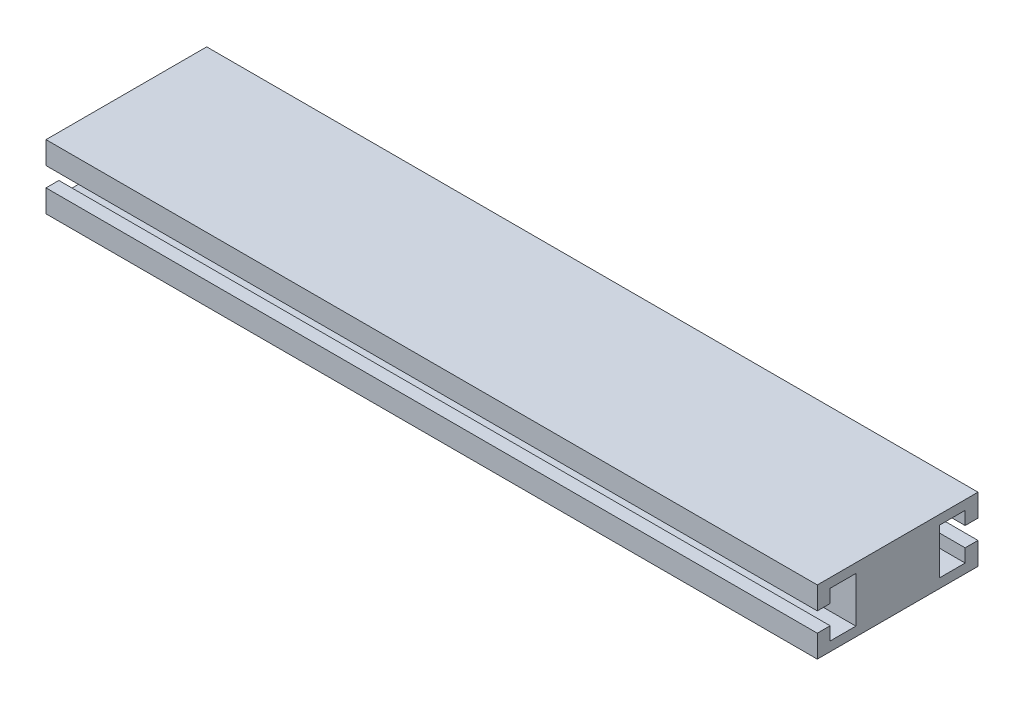
ISO-10303-21;
HEADER;
FILE_DESCRIPTION(('STEP AP214'),'2;1');
FILE_NAME('part.step','',(''),(''),'','','');
FILE_SCHEMA(('AUTOMOTIVE_DESIGN { 1 0 10303 214 1 1 1 1 }'));
ENDSEC;
DATA;
#1=APPLICATION_CONTEXT('core data for automotive mechanical design processes');
#2=APPLICATION_PROTOCOL_DEFINITION('international standard','automotive_design',2000,#1);
#3=PRODUCT_CONTEXT('',#1,'mechanical');
#4=PRODUCT('Part','Part','',(#3));
#5=PRODUCT_RELATED_PRODUCT_CATEGORY('part','',(#4));
#6=PRODUCT_DEFINITION_FORMATION('','',#4);
#7=PRODUCT_DEFINITION_CONTEXT('part definition',#1,'design');
#8=PRODUCT_DEFINITION('design','',#6,#7);
#9=PRODUCT_DEFINITION_SHAPE('','',#8);
#10=(LENGTH_UNIT() NAMED_UNIT(*) SI_UNIT(.MILLI.,.METRE.));
#11=(NAMED_UNIT(*) PLANE_ANGLE_UNIT() SI_UNIT($,.RADIAN.));
#12=(NAMED_UNIT(*) SI_UNIT($,.STERADIAN.) SOLID_ANGLE_UNIT());
#13=UNCERTAINTY_MEASURE_WITH_UNIT(LENGTH_MEASURE(1.E-05),#10,'distance_accuracy_value','');
#14=(GEOMETRIC_REPRESENTATION_CONTEXT(3) GLOBAL_UNCERTAINTY_ASSIGNED_CONTEXT((#13)) GLOBAL_UNIT_ASSIGNED_CONTEXT((#10,
#11,#12)) REPRESENTATION_CONTEXT('',''));
#15=CARTESIAN_POINT('',(0.,0.,0.));
#16=DIRECTION('',(0.,0.,1.));
#17=DIRECTION('',(1.,0.,0.));
#18=AXIS2_PLACEMENT_3D('',#15,#16,#17);
#19=CARTESIAN_POINT('',(-155.061127507297,10.,88.7726139502871));
#20=DIRECTION('',(0.,0.,-1.));
#21=DIRECTION('',(-1.,0.,0.));
#22=AXIS2_PLACEMENT_3D('',#19,#20,#21);
#23=PLANE('',#22);
#24=DIRECTION('',(0.,-1.,0.));
#25=VECTOR('',#24,1.);
#26=CARTESIAN_POINT('',(-155.061127507297,10.,88.7726139502871));
#27=LINE('',#26,#25);
#28=CARTESIAN_POINT('',(-155.061127507297,10.,88.7726139502871));
#29=VERTEX_POINT('',#28);
#30=CARTESIAN_POINT('',(-155.061127507297,6.5,88.7726139502871));
#31=VERTEX_POINT('',#30);
#32=EDGE_CURVE('E11',#29,#31,#27,.T.);
#33=ORIENTED_EDGE('',*,*,#32,.T.);
#34=DIRECTION('',(1.,0.,0.));
#35=VECTOR('',#34,1.);
#36=CARTESIAN_POINT('',(-155.061127507297,6.5,88.7726139502871));
#37=LINE('',#36,#35);
#38=CARTESIAN_POINT('',(-35.0611275072973,6.5,88.7726139502871));
#39=VERTEX_POINT('',#38);
#40=EDGE_CURVE('E262',#31,#39,#37,.T.);
#41=ORIENTED_EDGE('',*,*,#40,.T.);
#42=DIRECTION('',(0.,-1.,0.));
#43=VECTOR('',#42,1.);
#44=CARTESIAN_POINT('',(-35.0611275072973,10.,88.7726139502871));
#45=LINE('',#44,#43);
#46=CARTESIAN_POINT('',(-35.0611275072973,10.,88.7726139502871));
#47=VERTEX_POINT('',#46);
#48=EDGE_CURVE('E191',#47,#39,#45,.T.);
#49=ORIENTED_EDGE('',*,*,#48,.F.);
#50=DIRECTION('',(1.,0.,0.));
#51=VECTOR('',#50,1.);
#52=CARTESIAN_POINT('',(-155.061127507297,10.,88.7726139502871));
#53=LINE('',#52,#51);
#54=EDGE_CURVE('E221',#29,#47,#53,.T.);
#55=ORIENTED_EDGE('',*,*,#54,.F.);
#56=EDGE_LOOP('',(#33,#41,#49,#55));
#57=FACE_BOUND('',#56,.T.);
#58=ADVANCED_FACE('F33',(#57),#23,.F.);
#59=CARTESIAN_POINT('',(-155.061127507297,10.,63.7726139502871));
#60=DIRECTION('',(0.,0.,1.));
#61=DIRECTION('',(1.,0.,0.));
#62=AXIS2_PLACEMENT_3D('',#59,#60,#61);
#63=PLANE('',#62);
#64=DIRECTION('',(0.,-1.,0.));
#65=VECTOR('',#64,1.);
#66=CARTESIAN_POINT('',(-155.061127507297,10.,63.7726139502871));
#67=LINE('',#66,#65);
#68=CARTESIAN_POINT('',(-155.061127507297,3.5,63.7726139502871));
#69=VERTEX_POINT('',#68);
#70=CARTESIAN_POINT('',(-155.061127507297,0.,63.7726139502871));
#71=VERTEX_POINT('',#70);
#72=EDGE_CURVE('E205',#69,#71,#67,.T.);
#73=ORIENTED_EDGE('',*,*,#72,.F.);
#74=DIRECTION('',(1.,0.,0.));
#75=VECTOR('',#74,1.);
#76=CARTESIAN_POINT('',(-155.061127507297,3.5,63.7726139502871));
#77=LINE('',#76,#75);
#78=CARTESIAN_POINT('',(-35.0611275072973,3.5,63.7726139502871));
#79=VERTEX_POINT('',#78);
#80=EDGE_CURVE('E216',#69,#79,#77,.T.);
#81=ORIENTED_EDGE('',*,*,#80,.T.);
#82=DIRECTION('',(0.,-1.,0.));
#83=VECTOR('',#82,1.);
#84=CARTESIAN_POINT('',(-35.0611275072973,10.,63.7726139502871));
#85=LINE('',#84,#83);
#86=CARTESIAN_POINT('',(-35.0611275072973,0.,63.7726139502871));
#87=VERTEX_POINT('',#86);
#88=EDGE_CURVE('E201',#79,#87,#85,.T.);
#89=ORIENTED_EDGE('',*,*,#88,.T.);
#90=DIRECTION('',(-1.,0.,0.));
#91=VECTOR('',#90,1.);
#92=CARTESIAN_POINT('',(-155.061127507297,0.,63.7726139502871));
#93=LINE('',#92,#91);
#94=EDGE_CURVE('E206',#87,#71,#93,.T.);
#95=ORIENTED_EDGE('',*,*,#94,.T.);
#96=EDGE_LOOP('',(#73,#81,#89,#95));
#97=FACE_BOUND('',#96,.T.);
#98=ADVANCED_FACE('F387',(#97),#63,.F.);
#99=CARTESIAN_POINT('',(-155.061127507297,10.,88.7726139502871));
#100=DIRECTION('',(1.,0.,0.));
#101=DIRECTION('',(0.,0.,-1.));
#102=AXIS2_PLACEMENT_3D('',#99,#100,#101);
#103=PLANE('',#102);
#104=DIRECTION('',(0.,-1.,0.));
#105=VECTOR('',#104,1.);
#106=CARTESIAN_POINT('',(-155.061127507297,6.5,86.7726139502871));
#107=LINE('',#106,#105);
#108=CARTESIAN_POINT('',(-155.061127507297,8.55,86.7726139502871));
#109=VERTEX_POINT('',#108);
#110=CARTESIAN_POINT('',(-155.061127507297,6.5,86.7726139502871));
#111=VERTEX_POINT('',#110);
#112=EDGE_CURVE('E314',#109,#111,#107,.T.);
#113=ORIENTED_EDGE('',*,*,#112,.T.);
#114=DIRECTION('',(0.,0.,1.));
#115=VECTOR('',#114,1.);
#116=CARTESIAN_POINT('',(-155.061127507297,6.5,88.7726139502871));
#117=LINE('',#116,#115);
#118=EDGE_CURVE('E185',#111,#31,#117,.T.);
#119=ORIENTED_EDGE('',*,*,#118,.T.);
#120=ORIENTED_EDGE('',*,*,#32,.F.);
#121=DIRECTION('',(0.,0.,1.));
#122=VECTOR('',#121,1.);
#123=CARTESIAN_POINT('',(-155.061127507297,10.,88.7726139502871));
#124=LINE('',#123,#122);
#125=CARTESIAN_POINT('',(-155.061127507297,10.,63.7726139502871));
#126=VERTEX_POINT('',#125);
#127=EDGE_CURVE('E209',#126,#29,#124,.T.);
#128=ORIENTED_EDGE('',*,*,#127,.F.);
#129=CARTESIAN_POINT('',(-155.061127507297,6.5,63.7726139502871));
#130=VERTEX_POINT('',#129);
#131=EDGE_CURVE('E202',#126,#130,#67,.T.);
#132=ORIENTED_EDGE('',*,*,#131,.T.);
#133=DIRECTION('',(0.,0.,1.));
#134=VECTOR('',#133,1.);
#135=CARTESIAN_POINT('',(-155.061127507297,6.5,63.7726139502871));
#136=LINE('',#135,#134);
#137=CARTESIAN_POINT('',(-155.061127507297,6.5,65.7726139502871));
#138=VERTEX_POINT('',#137);
#139=EDGE_CURVE('E56',#130,#138,#136,.T.);
#140=ORIENTED_EDGE('',*,*,#139,.T.);
#141=DIRECTION('',(0.,1.,0.));
#142=VECTOR('',#141,1.);
#143=CARTESIAN_POINT('',(-155.061127507297,6.5,65.7726139502871));
#144=LINE('',#143,#142);
#145=CARTESIAN_POINT('',(-155.061127507297,8.55,65.7726139502871));
#146=VERTEX_POINT('',#145);
#147=EDGE_CURVE('E277',#138,#146,#144,.T.);
#148=ORIENTED_EDGE('',*,*,#147,.T.);
#149=DIRECTION('',(0.,0.,1.));
#150=VECTOR('',#149,1.);
#151=CARTESIAN_POINT('',(-155.061127507297,8.55,65.7726139502871));
#152=LINE('',#151,#150);
#153=CARTESIAN_POINT('',(-155.061127507297,8.55,69.7726139502871));
#154=VERTEX_POINT('',#153);
#155=EDGE_CURVE('E274',#146,#154,#152,.T.);
#156=ORIENTED_EDGE('',*,*,#155,.T.);
#157=DIRECTION('',(0.,-1.,0.));
#158=VECTOR('',#157,1.);
#159=CARTESIAN_POINT('',(-155.061127507297,8.55,69.7726139502871));
#160=LINE('',#159,#158);
#161=CARTESIAN_POINT('',(-155.061127507297,1.45,69.7726139502871));
#162=VERTEX_POINT('',#161);
#163=EDGE_CURVE('E271',#154,#162,#160,.T.);
#164=ORIENTED_EDGE('',*,*,#163,.T.);
#165=DIRECTION('',(0.,0.,-1.));
#166=VECTOR('',#165,1.);
#167=CARTESIAN_POINT('',(-155.061127507297,1.45,69.7726139502871));
#168=LINE('',#167,#166);
#169=CARTESIAN_POINT('',(-155.061127507297,1.45,65.7726139502871));
#170=VERTEX_POINT('',#169);
#171=EDGE_CURVE('E268',#162,#170,#168,.T.);
#172=ORIENTED_EDGE('',*,*,#171,.T.);
#173=DIRECTION('',(0.,1.,0.));
#174=VECTOR('',#173,1.);
#175=CARTESIAN_POINT('',(-155.061127507297,1.45,65.7726139502871));
#176=LINE('',#175,#174);
#177=CARTESIAN_POINT('',(-155.061127507297,3.5,65.7726139502871));
#178=VERTEX_POINT('',#177);
#179=EDGE_CURVE('E265',#170,#178,#176,.T.);
#180=ORIENTED_EDGE('',*,*,#179,.T.);
#181=DIRECTION('',(0.,0.,-1.));
#182=VECTOR('',#181,1.);
#183=CARTESIAN_POINT('',(-155.061127507297,3.5,65.7726139502871));
#184=LINE('',#183,#182);
#185=EDGE_CURVE('E228',#178,#69,#184,.T.);
#186=ORIENTED_EDGE('',*,*,#185,.T.);
#187=ORIENTED_EDGE('',*,*,#72,.T.);
#188=DIRECTION('',(0.,0.,1.));
#189=VECTOR('',#188,1.);
#190=CARTESIAN_POINT('',(-155.061127507297,0.,88.7726139502871));
#191=LINE('',#190,#189);
#192=CARTESIAN_POINT('',(-155.061127507297,0.,88.7726139502871));
#193=VERTEX_POINT('',#192);
#194=EDGE_CURVE('E190',#71,#193,#191,.T.);
#195=ORIENTED_EDGE('',*,*,#194,.T.);
#196=CARTESIAN_POINT('',(-155.061127507297,3.5,88.7726139502871));
#197=VERTEX_POINT('',#196);
#198=EDGE_CURVE('E41',#197,#193,#27,.T.);
#199=ORIENTED_EDGE('',*,*,#198,.F.);
#200=DIRECTION('',(0.,0.,-1.));
#201=VECTOR('',#200,1.);
#202=CARTESIAN_POINT('',(-155.061127507297,3.5,86.7726139502871));
#203=LINE('',#202,#201);
#204=CARTESIAN_POINT('',(-155.061127507297,3.5,86.7726139502871));
#205=VERTEX_POINT('',#204);
#206=EDGE_CURVE('E169',#197,#205,#203,.T.);
#207=ORIENTED_EDGE('',*,*,#206,.T.);
#208=DIRECTION('',(0.,-1.,0.));
#209=VECTOR('',#208,1.);
#210=CARTESIAN_POINT('',(-155.061127507297,1.45,86.7726139502871));
#211=LINE('',#210,#209);
#212=CARTESIAN_POINT('',(-155.061127507297,1.45,86.7726139502871));
#213=VERTEX_POINT('',#212);
#214=EDGE_CURVE('E176',#205,#213,#211,.T.);
#215=ORIENTED_EDGE('',*,*,#214,.T.);
#216=DIRECTION('',(0.,0.,-1.));
#217=VECTOR('',#216,1.);
#218=CARTESIAN_POINT('',(-155.061127507297,1.45,82.7726139502871));
#219=LINE('',#218,#217);
#220=CARTESIAN_POINT('',(-155.061127507297,1.45,82.7726139502871));
#221=VERTEX_POINT('',#220);
#222=EDGE_CURVE('E322',#213,#221,#219,.T.);
#223=ORIENTED_EDGE('',*,*,#222,.T.);
#224=DIRECTION('',(0.,1.,0.));
#225=VECTOR('',#224,1.);
#226=CARTESIAN_POINT('',(-155.061127507297,8.55,82.7726139502871));
#227=LINE('',#226,#225);
#228=CARTESIAN_POINT('',(-155.061127507297,8.55,82.7726139502871));
#229=VERTEX_POINT('',#228);
#230=EDGE_CURVE('E319',#221,#229,#227,.T.);
#231=ORIENTED_EDGE('',*,*,#230,.T.);
#232=DIRECTION('',(0.,0.,1.));
#233=VECTOR('',#232,1.);
#234=CARTESIAN_POINT('',(-155.061127507297,8.55,86.7726139502871));
#235=LINE('',#234,#233);
#236=EDGE_CURVE('E316',#229,#109,#235,.T.);
#237=ORIENTED_EDGE('',*,*,#236,.T.);
#238=EDGE_LOOP('',(#113,#119,#120,#128,#132,#140,#148,#156,#164,#172,#180,#186,#187,#195,#199,
#207,#215,#223,#231,#237));
#239=FACE_BOUND('',#238,.T.);
#240=ADVANCED_FACE('F35',(#239),#103,.F.);
#241=CARTESIAN_POINT('',(-35.0611275072973,3.5,88.7726139502871));
#242=VERTEX_POINT('',#241);
#243=CARTESIAN_POINT('',(-35.0611275072973,0.,88.7726139502871));
#244=VERTEX_POINT('',#243);
#245=EDGE_CURVE('E184',#242,#244,#45,.T.);
#246=ORIENTED_EDGE('',*,*,#245,.F.);
#247=DIRECTION('',(1.,0.,0.));
#248=VECTOR('',#247,1.);
#249=CARTESIAN_POINT('',(-155.061127507297,3.5,88.7726139502871));
#250=LINE('',#249,#248);
#251=EDGE_CURVE('E48',#197,#242,#250,.T.);
#252=ORIENTED_EDGE('',*,*,#251,.F.);
#253=ORIENTED_EDGE('',*,*,#198,.T.);
#254=DIRECTION('',(1.,0.,0.));
#255=VECTOR('',#254,1.);
#256=CARTESIAN_POINT('',(-155.061127507297,0.,88.7726139502871));
#257=LINE('',#256,#255);
#258=EDGE_CURVE('E213',#193,#244,#257,.T.);
#259=ORIENTED_EDGE('',*,*,#258,.T.);
#260=EDGE_LOOP('',(#246,#252,#253,#259));
#261=FACE_BOUND('',#260,.T.);
#262=ADVANCED_FACE('F181',(#261),#23,.F.);
#263=CARTESIAN_POINT('',(-35.0611275072973,10.,88.7726139502871));
#264=DIRECTION('',(-1.,0.,0.));
#265=DIRECTION('',(0.,0.,1.));
#266=AXIS2_PLACEMENT_3D('',#263,#264,#265);
#267=PLANE('',#266);
#268=ORIENTED_EDGE('',*,*,#48,.T.);
#269=DIRECTION('',(0.,0.,1.));
#270=VECTOR('',#269,1.);
#271=CARTESIAN_POINT('',(-35.0611275072973,6.5,88.7726139502871));
#272=LINE('',#271,#270);
#273=CARTESIAN_POINT('',(-35.0611275072973,6.5,86.7726139502871));
#274=VERTEX_POINT('',#273);
#275=EDGE_CURVE('E177',#274,#39,#272,.T.);
#276=ORIENTED_EDGE('',*,*,#275,.F.);
#277=DIRECTION('',(0.,-1.,0.));
#278=VECTOR('',#277,1.);
#279=CARTESIAN_POINT('',(-35.0611275072973,6.5,86.7726139502871));
#280=LINE('',#279,#278);
#281=CARTESIAN_POINT('',(-35.0611275072973,8.55,86.7726139502871));
#282=VERTEX_POINT('',#281);
#283=EDGE_CURVE('E295',#282,#274,#280,.T.);
#284=ORIENTED_EDGE('',*,*,#283,.F.);
#285=DIRECTION('',(0.,0.,1.));
#286=VECTOR('',#285,1.);
#287=CARTESIAN_POINT('',(-35.0611275072973,8.55,86.7726139502871));
#288=LINE('',#287,#286);
#289=CARTESIAN_POINT('',(-35.0611275072973,8.55,82.7726139502871));
#290=VERTEX_POINT('',#289);
#291=EDGE_CURVE('E298',#290,#282,#288,.T.);
#292=ORIENTED_EDGE('',*,*,#291,.F.);
#293=DIRECTION('',(0.,1.,0.));
#294=VECTOR('',#293,1.);
#295=CARTESIAN_POINT('',(-35.0611275072973,8.55,82.7726139502871));
#296=LINE('',#295,#294);
#297=CARTESIAN_POINT('',(-35.0611275072973,1.45,82.7726139502871));
#298=VERTEX_POINT('',#297);
#299=EDGE_CURVE('E301',#298,#290,#296,.T.);
#300=ORIENTED_EDGE('',*,*,#299,.F.);
#301=DIRECTION('',(0.,0.,-1.));
#302=VECTOR('',#301,1.);
#303=CARTESIAN_POINT('',(-35.0611275072973,1.45,82.7726139502871));
#304=LINE('',#303,#302);
#305=CARTESIAN_POINT('',(-35.0611275072973,1.45,86.7726139502871));
#306=VERTEX_POINT('',#305);
#307=EDGE_CURVE('E304',#306,#298,#304,.T.);
#308=ORIENTED_EDGE('',*,*,#307,.F.);
#309=DIRECTION('',(0.,-1.,0.));
#310=VECTOR('',#309,1.);
#311=CARTESIAN_POINT('',(-35.0611275072973,1.45,86.7726139502871));
#312=LINE('',#311,#310);
#313=CARTESIAN_POINT('',(-35.0611275072973,3.5,86.7726139502871));
#314=VERTEX_POINT('',#313);
#315=EDGE_CURVE('E307',#314,#306,#312,.T.);
#316=ORIENTED_EDGE('',*,*,#315,.F.);
#317=DIRECTION('',(0.,0.,-1.));
#318=VECTOR('',#317,1.);
#319=CARTESIAN_POINT('',(-35.0611275072973,3.5,86.7726139502871));
#320=LINE('',#319,#318);
#321=EDGE_CURVE('E310',#242,#314,#320,.T.);
#322=ORIENTED_EDGE('',*,*,#321,.F.);
#323=ORIENTED_EDGE('',*,*,#245,.T.);
#324=DIRECTION('',(0.,0.,-1.));
#325=VECTOR('',#324,1.);
#326=CARTESIAN_POINT('',(-35.0611275072973,0.,88.7726139502871));
#327=LINE('',#326,#325);
#328=EDGE_CURVE('E210',#244,#87,#327,.T.);
#329=ORIENTED_EDGE('',*,*,#328,.T.);
#330=ORIENTED_EDGE('',*,*,#88,.F.);
#331=DIRECTION('',(0.,0.,-1.));
#332=VECTOR('',#331,1.);
#333=CARTESIAN_POINT('',(-35.0611275072973,3.5,65.7726139502871));
#334=LINE('',#333,#332);
#335=CARTESIAN_POINT('',(-35.0611275072973,3.5,65.7726139502871));
#336=VERTEX_POINT('',#335);
#337=EDGE_CURVE('E242',#336,#79,#334,.T.);
#338=ORIENTED_EDGE('',*,*,#337,.F.);
#339=DIRECTION('',(0.,1.,0.));
#340=VECTOR('',#339,1.);
#341=CARTESIAN_POINT('',(-35.0611275072973,1.45,65.7726139502871));
#342=LINE('',#341,#340);
#343=CARTESIAN_POINT('',(-35.0611275072973,1.45,65.7726139502871));
#344=VERTEX_POINT('',#343);
#345=EDGE_CURVE('E244',#344,#336,#342,.T.);
#346=ORIENTED_EDGE('',*,*,#345,.F.);
#347=DIRECTION('',(0.,0.,-1.));
#348=VECTOR('',#347,1.);
#349=CARTESIAN_POINT('',(-35.0611275072973,1.45,69.7726139502871));
#350=LINE('',#349,#348);
#351=CARTESIAN_POINT('',(-35.0611275072973,1.45,69.7726139502871));
#352=VERTEX_POINT('',#351);
#353=EDGE_CURVE('E247',#352,#344,#350,.T.);
#354=ORIENTED_EDGE('',*,*,#353,.F.);
#355=DIRECTION('',(0.,-1.,0.));
#356=VECTOR('',#355,1.);
#357=CARTESIAN_POINT('',(-35.0611275072973,8.55,69.7726139502871));
#358=LINE('',#357,#356);
#359=CARTESIAN_POINT('',(-35.0611275072973,8.55,69.7726139502871));
#360=VERTEX_POINT('',#359);
#361=EDGE_CURVE('E250',#360,#352,#358,.T.);
#362=ORIENTED_EDGE('',*,*,#361,.F.);
#363=DIRECTION('',(0.,0.,1.));
#364=VECTOR('',#363,1.);
#365=CARTESIAN_POINT('',(-35.0611275072973,8.55,65.7726139502871));
#366=LINE('',#365,#364);
#367=CARTESIAN_POINT('',(-35.0611275072973,8.55,65.7726139502871));
#368=VERTEX_POINT('',#367);
#369=EDGE_CURVE('E253',#368,#360,#366,.T.);
#370=ORIENTED_EDGE('',*,*,#369,.F.);
#371=DIRECTION('',(0.,1.,0.));
#372=VECTOR('',#371,1.);
#373=CARTESIAN_POINT('',(-35.0611275072973,6.5,65.7726139502871));
#374=LINE('',#373,#372);
#375=CARTESIAN_POINT('',(-35.0611275072973,6.5,65.7726139502871));
#376=VERTEX_POINT('',#375);
#377=EDGE_CURVE('E256',#376,#368,#374,.T.);
#378=ORIENTED_EDGE('',*,*,#377,.F.);
#379=DIRECTION('',(0.,0.,1.));
#380=VECTOR('',#379,1.);
#381=CARTESIAN_POINT('',(-35.0611275072973,6.5,63.7726139502871));
#382=LINE('',#381,#380);
#383=CARTESIAN_POINT('',(-35.0611275072973,6.5,63.7726139502871));
#384=VERTEX_POINT('',#383);
#385=EDGE_CURVE('E259',#384,#376,#382,.T.);
#386=ORIENTED_EDGE('',*,*,#385,.F.);
#387=CARTESIAN_POINT('',(-35.0611275072973,10.,63.7726139502871));
#388=VERTEX_POINT('',#387);
#389=EDGE_CURVE('E197',#388,#384,#85,.T.);
#390=ORIENTED_EDGE('',*,*,#389,.F.);
#391=DIRECTION('',(0.,0.,-1.));
#392=VECTOR('',#391,1.);
#393=CARTESIAN_POINT('',(-35.0611275072973,10.,88.7726139502871));
#394=LINE('',#393,#392);
#395=EDGE_CURVE('E219',#47,#388,#394,.T.);
#396=ORIENTED_EDGE('',*,*,#395,.F.);
#397=EDGE_LOOP('',(#268,#276,#284,#292,#300,#308,#316,#322,#323,#329,#330,#338,#346,#354,#362,
#370,#378,#386,#390,#396));
#398=FACE_BOUND('',#397,.T.);
#399=ADVANCED_FACE('F360',(#398),#267,.F.);
#400=ORIENTED_EDGE('',*,*,#389,.T.);
#401=DIRECTION('',(1.,0.,0.));
#402=VECTOR('',#401,1.);
#403=CARTESIAN_POINT('',(-155.061127507297,6.5,63.7726139502871));
#404=LINE('',#403,#402);
#405=EDGE_CURVE('E225',#130,#384,#404,.T.);
#406=ORIENTED_EDGE('',*,*,#405,.F.);
#407=ORIENTED_EDGE('',*,*,#131,.F.);
#408=DIRECTION('',(-1.,0.,0.));
#409=VECTOR('',#408,1.);
#410=CARTESIAN_POINT('',(-155.061127507297,10.,63.7726139502871));
#411=LINE('',#410,#409);
#412=EDGE_CURVE('E217',#388,#126,#411,.T.);
#413=ORIENTED_EDGE('',*,*,#412,.F.);
#414=EDGE_LOOP('',(#400,#406,#407,#413));
#415=FACE_BOUND('',#414,.T.);
#416=ADVANCED_FACE('F355',(#415),#63,.F.);
#417=CARTESIAN_POINT('',(0.,10.,0.));
#418=DIRECTION('',(0.,-1.,0.));
#419=DIRECTION('',(0.,0.,-1.));
#420=AXIS2_PLACEMENT_3D('',#417,#418,#419);
#421=PLANE('',#420);
#422=ORIENTED_EDGE('',*,*,#127,.T.);
#423=ORIENTED_EDGE('',*,*,#54,.T.);
#424=ORIENTED_EDGE('',*,*,#395,.T.);
#425=ORIENTED_EDGE('',*,*,#412,.T.);
#426=EDGE_LOOP('',(#422,#423,#424,#425));
#427=FACE_BOUND('',#426,.T.);
#428=ADVANCED_FACE('F351',(#427),#421,.F.);
#429=CARTESIAN_POINT('',(0.,0.,0.));
#430=DIRECTION('',(0.,-1.,0.));
#431=DIRECTION('',(0.,0.,-1.));
#432=AXIS2_PLACEMENT_3D('',#429,#430,#431);
#433=PLANE('',#432);
#434=ORIENTED_EDGE('',*,*,#194,.F.);
#435=ORIENTED_EDGE('',*,*,#94,.F.);
#436=ORIENTED_EDGE('',*,*,#328,.F.);
#437=ORIENTED_EDGE('',*,*,#258,.F.);
#438=EDGE_LOOP('',(#434,#435,#436,#437));
#439=FACE_BOUND('',#438,.T.);
#440=ADVANCED_FACE('F391',(#439),#433,.T.);
#441=CARTESIAN_POINT('',(-155.061127507297,3.5,65.7726139502871));
#442=DIRECTION('',(0.,-1.,0.));
#443=DIRECTION('',(0.,0.,-1.));
#444=AXIS2_PLACEMENT_3D('',#441,#442,#443);
#445=PLANE('',#444);
#446=ORIENTED_EDGE('',*,*,#337,.T.);
#447=ORIENTED_EDGE('',*,*,#80,.F.);
#448=ORIENTED_EDGE('',*,*,#185,.F.);
#449=DIRECTION('',(1.,0.,0.));
#450=VECTOR('',#449,1.);
#451=CARTESIAN_POINT('',(-155.061127507297,3.5,65.7726139502871));
#452=LINE('',#451,#450);
#453=EDGE_CURVE('E238',#178,#336,#452,.T.);
#454=ORIENTED_EDGE('',*,*,#453,.T.);
#455=EDGE_LOOP('',(#446,#447,#448,#454));
#456=FACE_BOUND('',#455,.T.);
#457=ADVANCED_FACE('F384',(#456),#445,.F.);
#458=CARTESIAN_POINT('',(-155.061127507297,1.45,65.7726139502871));
#459=DIRECTION('',(0.,0.,-1.));
#460=DIRECTION('',(-1.,0.,0.));
#461=AXIS2_PLACEMENT_3D('',#458,#459,#460);
#462=PLANE('',#461);
#463=ORIENTED_EDGE('',*,*,#345,.T.);
#464=ORIENTED_EDGE('',*,*,#453,.F.);
#465=ORIENTED_EDGE('',*,*,#179,.F.);
#466=DIRECTION('',(1.,0.,0.));
#467=VECTOR('',#466,1.);
#468=CARTESIAN_POINT('',(-155.061127507297,1.45,65.7726139502871));
#469=LINE('',#468,#467);
#470=EDGE_CURVE('E236',#170,#344,#469,.T.);
#471=ORIENTED_EDGE('',*,*,#470,.T.);
#472=EDGE_LOOP('',(#463,#464,#465,#471));
#473=FACE_BOUND('',#472,.T.);
#474=ADVANCED_FACE('F380',(#473),#462,.F.);
#475=CARTESIAN_POINT('',(-155.061127507297,1.45,69.7726139502871));
#476=DIRECTION('',(0.,-1.,0.));
#477=DIRECTION('',(0.,0.,-1.));
#478=AXIS2_PLACEMENT_3D('',#475,#476,#477);
#479=PLANE('',#478);
#480=ORIENTED_EDGE('',*,*,#353,.T.);
#481=ORIENTED_EDGE('',*,*,#470,.F.);
#482=ORIENTED_EDGE('',*,*,#171,.F.);
#483=DIRECTION('',(1.,0.,0.));
#484=VECTOR('',#483,1.);
#485=CARTESIAN_POINT('',(-155.061127507297,1.45,69.7726139502871));
#486=LINE('',#485,#484);
#487=EDGE_CURVE('E234',#162,#352,#486,.T.);
#488=ORIENTED_EDGE('',*,*,#487,.T.);
#489=EDGE_LOOP('',(#480,#481,#482,#488));
#490=FACE_BOUND('',#489,.T.);
#491=ADVANCED_FACE('F375',(#490),#479,.F.);
#492=CARTESIAN_POINT('',(-155.061127507297,8.55,69.7726139502871));
#493=DIRECTION('',(0.,0.,1.));
#494=DIRECTION('',(1.,0.,0.));
#495=AXIS2_PLACEMENT_3D('',#492,#493,#494);
#496=PLANE('',#495);
#497=ORIENTED_EDGE('',*,*,#361,.T.);
#498=ORIENTED_EDGE('',*,*,#487,.F.);
#499=ORIENTED_EDGE('',*,*,#163,.F.);
#500=DIRECTION('',(1.,0.,0.));
#501=VECTOR('',#500,1.);
#502=CARTESIAN_POINT('',(-155.061127507297,8.55,69.7726139502871));
#503=LINE('',#502,#501);
#504=EDGE_CURVE('E232',#154,#360,#503,.T.);
#505=ORIENTED_EDGE('',*,*,#504,.T.);
#506=EDGE_LOOP('',(#497,#498,#499,#505));
#507=FACE_BOUND('',#506,.T.);
#508=ADVANCED_FACE('F371',(#507),#496,.F.);
#509=CARTESIAN_POINT('',(-155.061127507297,8.55,65.7726139502871));
#510=DIRECTION('',(0.,1.,0.));
#511=DIRECTION('',(0.,0.,1.));
#512=AXIS2_PLACEMENT_3D('',#509,#510,#511);
#513=PLANE('',#512);
#514=ORIENTED_EDGE('',*,*,#369,.T.);
#515=ORIENTED_EDGE('',*,*,#504,.F.);
#516=ORIENTED_EDGE('',*,*,#155,.F.);
#517=DIRECTION('',(1.,0.,0.));
#518=VECTOR('',#517,1.);
#519=CARTESIAN_POINT('',(-155.061127507297,8.55,65.7726139502871));
#520=LINE('',#519,#518);
#521=EDGE_CURVE('E230',#146,#368,#520,.T.);
#522=ORIENTED_EDGE('',*,*,#521,.T.);
#523=EDGE_LOOP('',(#514,#515,#516,#522));
#524=FACE_BOUND('',#523,.T.);
#525=ADVANCED_FACE('F369',(#524),#513,.F.);
#526=CARTESIAN_POINT('',(-155.061127507297,6.5,65.7726139502871));
#527=DIRECTION('',(0.,0.,-1.));
#528=DIRECTION('',(-1.,0.,0.));
#529=AXIS2_PLACEMENT_3D('',#526,#527,#528);
#530=PLANE('',#529);
#531=ORIENTED_EDGE('',*,*,#377,.T.);
#532=ORIENTED_EDGE('',*,*,#521,.F.);
#533=ORIENTED_EDGE('',*,*,#147,.F.);
#534=DIRECTION('',(1.,0.,0.));
#535=VECTOR('',#534,1.);
#536=CARTESIAN_POINT('',(-155.061127507297,6.5,65.7726139502871));
#537=LINE('',#536,#535);
#538=EDGE_CURVE('E227',#138,#376,#537,.T.);
#539=ORIENTED_EDGE('',*,*,#538,.T.);
#540=EDGE_LOOP('',(#531,#532,#533,#539));
#541=FACE_BOUND('',#540,.T.);
#542=ADVANCED_FACE('F364',(#541),#530,.F.);
#543=CARTESIAN_POINT('',(-155.061127507297,6.5,63.7726139502871));
#544=DIRECTION('',(0.,1.,0.));
#545=DIRECTION('',(0.,0.,1.));
#546=AXIS2_PLACEMENT_3D('',#543,#544,#545);
#547=PLANE('',#546);
#548=ORIENTED_EDGE('',*,*,#385,.T.);
#549=ORIENTED_EDGE('',*,*,#538,.F.);
#550=ORIENTED_EDGE('',*,*,#139,.F.);
#551=ORIENTED_EDGE('',*,*,#405,.T.);
#552=EDGE_LOOP('',(#548,#549,#550,#551));
#553=FACE_BOUND('',#552,.T.);
#554=ADVANCED_FACE('F358',(#553),#547,.F.);
#555=CARTESIAN_POINT('',(-155.061127507297,6.5,88.7726139502871));
#556=DIRECTION('',(0.,1.,0.));
#557=DIRECTION('',(0.,0.,1.));
#558=AXIS2_PLACEMENT_3D('',#555,#556,#557);
#559=PLANE('',#558);
#560=ORIENTED_EDGE('',*,*,#275,.T.);
#561=ORIENTED_EDGE('',*,*,#40,.F.);
#562=ORIENTED_EDGE('',*,*,#118,.F.);
#563=DIRECTION('',(1.,0.,0.));
#564=VECTOR('',#563,1.);
#565=CARTESIAN_POINT('',(-155.061127507297,6.5,86.7726139502871));
#566=LINE('',#565,#564);
#567=EDGE_CURVE('E290',#111,#274,#566,.T.);
#568=ORIENTED_EDGE('',*,*,#567,.T.);
#569=EDGE_LOOP('',(#560,#561,#562,#568));
#570=FACE_BOUND('',#569,.T.);
#571=ADVANCED_FACE('F346',(#570),#559,.F.);
#572=CARTESIAN_POINT('',(-155.061127507297,6.5,86.7726139502871));
#573=DIRECTION('',(0.,0.,1.));
#574=DIRECTION('',(1.,0.,0.));
#575=AXIS2_PLACEMENT_3D('',#572,#573,#574);
#576=PLANE('',#575);
#577=ORIENTED_EDGE('',*,*,#283,.T.);
#578=ORIENTED_EDGE('',*,*,#567,.F.);
#579=ORIENTED_EDGE('',*,*,#112,.F.);
#580=DIRECTION('',(1.,0.,0.));
#581=VECTOR('',#580,1.);
#582=CARTESIAN_POINT('',(-155.061127507297,8.55,86.7726139502871));
#583=LINE('',#582,#581);
#584=EDGE_CURVE('E288',#109,#282,#583,.T.);
#585=ORIENTED_EDGE('',*,*,#584,.T.);
#586=EDGE_LOOP('',(#577,#578,#579,#585));
#587=FACE_BOUND('',#586,.T.);
#588=ADVANCED_FACE('F343',(#587),#576,.F.);
#589=CARTESIAN_POINT('',(-155.061127507297,8.55,86.7726139502871));
#590=DIRECTION('',(0.,1.,0.));
#591=DIRECTION('',(0.,0.,1.));
#592=AXIS2_PLACEMENT_3D('',#589,#590,#591);
#593=PLANE('',#592);
#594=ORIENTED_EDGE('',*,*,#291,.T.);
#595=ORIENTED_EDGE('',*,*,#584,.F.);
#596=ORIENTED_EDGE('',*,*,#236,.F.);
#597=DIRECTION('',(1.,0.,0.));
#598=VECTOR('',#597,1.);
#599=CARTESIAN_POINT('',(-155.061127507297,8.55,82.7726139502871));
#600=LINE('',#599,#598);
#601=EDGE_CURVE('E286',#229,#290,#600,.T.);
#602=ORIENTED_EDGE('',*,*,#601,.T.);
#603=EDGE_LOOP('',(#594,#595,#596,#602));
#604=FACE_BOUND('',#603,.T.);
#605=ADVANCED_FACE('F339',(#604),#593,.F.);
#606=CARTESIAN_POINT('',(-155.061127507297,8.55,82.7726139502871));
#607=DIRECTION('',(0.,0.,-1.));
#608=DIRECTION('',(-1.,0.,0.));
#609=AXIS2_PLACEMENT_3D('',#606,#607,#608);
#610=PLANE('',#609);
#611=ORIENTED_EDGE('',*,*,#299,.T.);
#612=ORIENTED_EDGE('',*,*,#601,.F.);
#613=ORIENTED_EDGE('',*,*,#230,.F.);
#614=DIRECTION('',(1.,0.,0.));
#615=VECTOR('',#614,1.);
#616=CARTESIAN_POINT('',(-155.061127507297,1.45,82.7726139502871));
#617=LINE('',#616,#615);
#618=EDGE_CURVE('E284',#221,#298,#617,.T.);
#619=ORIENTED_EDGE('',*,*,#618,.T.);
#620=EDGE_LOOP('',(#611,#612,#613,#619));
#621=FACE_BOUND('',#620,.T.);
#622=ADVANCED_FACE('F335',(#621),#610,.F.);
#623=CARTESIAN_POINT('',(-155.061127507297,1.45,82.7726139502871));
#624=DIRECTION('',(0.,-1.,0.));
#625=DIRECTION('',(0.,0.,-1.));
#626=AXIS2_PLACEMENT_3D('',#623,#624,#625);
#627=PLANE('',#626);
#628=ORIENTED_EDGE('',*,*,#307,.T.);
#629=ORIENTED_EDGE('',*,*,#618,.F.);
#630=ORIENTED_EDGE('',*,*,#222,.F.);
#631=DIRECTION('',(1.,0.,0.));
#632=VECTOR('',#631,1.);
#633=CARTESIAN_POINT('',(-155.061127507297,1.45,86.7726139502871));
#634=LINE('',#633,#632);
#635=EDGE_CURVE('E282',#213,#306,#634,.T.);
#636=ORIENTED_EDGE('',*,*,#635,.T.);
#637=EDGE_LOOP('',(#628,#629,#630,#636));
#638=FACE_BOUND('',#637,.T.);
#639=ADVANCED_FACE('F331',(#638),#627,.F.);
#640=CARTESIAN_POINT('',(-155.061127507297,1.45,86.7726139502871));
#641=DIRECTION('',(0.,0.,1.));
#642=DIRECTION('',(1.,0.,0.));
#643=AXIS2_PLACEMENT_3D('',#640,#641,#642);
#644=PLANE('',#643);
#645=ORIENTED_EDGE('',*,*,#315,.T.);
#646=ORIENTED_EDGE('',*,*,#635,.F.);
#647=ORIENTED_EDGE('',*,*,#214,.F.);
#648=DIRECTION('',(1.,0.,0.));
#649=VECTOR('',#648,1.);
#650=CARTESIAN_POINT('',(-155.061127507297,3.5,86.7726139502871));
#651=LINE('',#650,#649);
#652=EDGE_CURVE('E171',#205,#314,#651,.T.);
#653=ORIENTED_EDGE('',*,*,#652,.T.);
#654=EDGE_LOOP('',(#645,#646,#647,#653));
#655=FACE_BOUND('',#654,.T.);
#656=ADVANCED_FACE('F327',(#655),#644,.F.);
#657=CARTESIAN_POINT('',(-155.061127507297,3.5,86.7726139502871));
#658=DIRECTION('',(0.,-1.,0.));
#659=DIRECTION('',(0.,0.,-1.));
#660=AXIS2_PLACEMENT_3D('',#657,#658,#659);
#661=PLANE('',#660);
#662=ORIENTED_EDGE('',*,*,#321,.T.);
#663=ORIENTED_EDGE('',*,*,#652,.F.);
#664=ORIENTED_EDGE('',*,*,#206,.F.);
#665=ORIENTED_EDGE('',*,*,#251,.T.);
#666=EDGE_LOOP('',(#662,#663,#664,#665));
#667=FACE_BOUND('',#666,.T.);
#668=ADVANCED_FACE('F170',(#667),#661,.F.);
#669=CLOSED_SHELL('',(#58,#98,#240,#262,#399,#416,#428,#440,#457,#474,#491,#508,#525,#542,#554,
#571,#588,#605,#622,#639,#656,#668));
#670=MANIFOLD_SOLID_BREP('B2',#669);
#671=ADVANCED_BREP_SHAPE_REPRESENTATION('',(#18,#670),#14);
#672=SHAPE_DEFINITION_REPRESENTATION(#9,#671);
ENDSEC;
END-ISO-10303-21;
